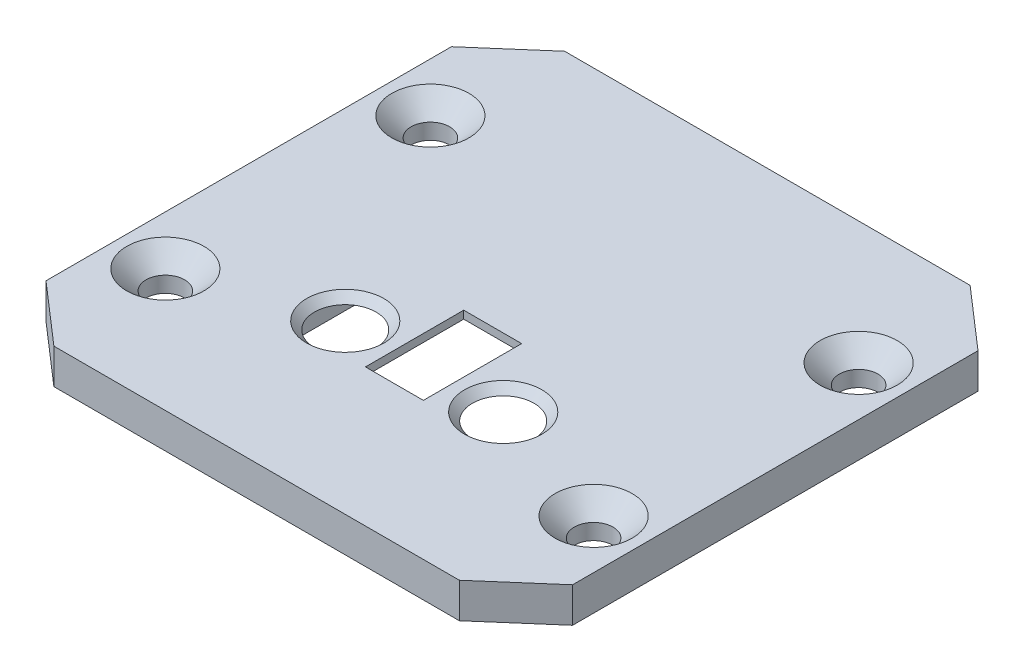
ISO-10303-21;
HEADER;
FILE_DESCRIPTION(('STEP AP214'),'2;1');
FILE_NAME('part.step','',(''),(''),'','','');
FILE_SCHEMA(('AUTOMOTIVE_DESIGN { 1 0 10303 214 1 1 1 1 }'));
ENDSEC;
DATA;
#1=APPLICATION_CONTEXT('core data for automotive mechanical design processes');
#2=APPLICATION_PROTOCOL_DEFINITION('international standard','automotive_design',2000,#1);
#3=PRODUCT_CONTEXT('',#1,'mechanical');
#4=PRODUCT('Part','Part','',(#3));
#5=PRODUCT_RELATED_PRODUCT_CATEGORY('part','',(#4));
#6=PRODUCT_DEFINITION_FORMATION('','',#4);
#7=PRODUCT_DEFINITION_CONTEXT('part definition',#1,'design');
#8=PRODUCT_DEFINITION('design','',#6,#7);
#9=PRODUCT_DEFINITION_SHAPE('','',#8);
#10=(LENGTH_UNIT() NAMED_UNIT(*) SI_UNIT(.MILLI.,.METRE.));
#11=(NAMED_UNIT(*) PLANE_ANGLE_UNIT() SI_UNIT($,.RADIAN.));
#12=(NAMED_UNIT(*) SI_UNIT($,.STERADIAN.) SOLID_ANGLE_UNIT());
#13=UNCERTAINTY_MEASURE_WITH_UNIT(LENGTH_MEASURE(1.E-05),#10,'distance_accuracy_value','');
#14=(GEOMETRIC_REPRESENTATION_CONTEXT(3) GLOBAL_UNCERTAINTY_ASSIGNED_CONTEXT((#13)) GLOBAL_UNIT_ASSIGNED_CONTEXT((#10,
#11,#12)) REPRESENTATION_CONTEXT('',''));
#15=CARTESIAN_POINT('',(0.,0.,0.));
#16=DIRECTION('',(0.,0.,1.));
#17=DIRECTION('',(1.,0.,0.));
#18=AXIS2_PLACEMENT_3D('',#15,#16,#17);
#19=CARTESIAN_POINT('',(0.,0.,0.));
#20=DIRECTION('',(0.,1.,0.));
#21=DIRECTION('',(0.,0.,1.));
#22=AXIS2_PLACEMENT_3D('',#19,#20,#21);
#23=PLANE('',#22);
#24=DIRECTION('',(-0.754605522163498,0.,0.656178714924794));
#25=VECTOR('',#24,1.);
#26=CARTESIAN_POINT('',(-6.6972861855531,0.,-22.7975658796558));
#27=LINE('',#26,#25);
#28=CARTESIAN_POINT('',(-6.6972861855531,0.,-22.7975658796558));
#29=VERTEX_POINT('',#28);
#30=CARTESIAN_POINT('',(-10.1472861855532,0.,-19.7975658796556));
#31=VERTEX_POINT('',#30);
#32=EDGE_CURVE('E275',#29,#31,#27,.T.);
#33=ORIENTED_EDGE('',*,*,#32,.F.);
#34=DIRECTION('',(-1.,0.,0.));
#35=VECTOR('',#34,1.);
#36=CARTESIAN_POINT('',(16.4027138144468,0.,-22.7975658796558));
#37=LINE('',#36,#35);
#38=CARTESIAN_POINT('',(16.4027138144468,0.,-22.7975658796558));
#39=VERTEX_POINT('',#38);
#40=EDGE_CURVE('E260',#39,#29,#37,.T.);
#41=ORIENTED_EDGE('',*,*,#40,.F.);
#42=DIRECTION('',(-0.754605522163498,0.,-0.656178714924794));
#43=VECTOR('',#42,1.);
#44=CARTESIAN_POINT('',(19.8527138144469,0.,-19.7975658796556));
#45=LINE('',#44,#43);
#46=CARTESIAN_POINT('',(19.8527138144469,0.,-19.7975658796556));
#47=VERTEX_POINT('',#46);
#48=EDGE_CURVE('E288',#47,#39,#45,.T.);
#49=ORIENTED_EDGE('',*,*,#48,.F.);
#50=DIRECTION('',(0.,0.,-1.));
#51=VECTOR('',#50,1.);
#52=CARTESIAN_POINT('',(19.8527138144469,0.,3.30243412034426));
#53=LINE('',#52,#51);
#54=CARTESIAN_POINT('',(19.8527138144469,0.,3.30243412034426));
#55=VERTEX_POINT('',#54);
#56=EDGE_CURVE('E286',#55,#47,#53,.T.);
#57=ORIENTED_EDGE('',*,*,#56,.F.);
#58=DIRECTION('',(0.754605522163498,0.,-0.656178714924794));
#59=VECTOR('',#58,1.);
#60=CARTESIAN_POINT('',(16.4027138144468,0.,6.30243412034437));
#61=LINE('',#60,#59);
#62=CARTESIAN_POINT('',(16.4027138144468,0.,6.30243412034437));
#63=VERTEX_POINT('',#62);
#64=EDGE_CURVE('E284',#63,#55,#61,.T.);
#65=ORIENTED_EDGE('',*,*,#64,.F.);
#66=DIRECTION('',(1.,0.,0.));
#67=VECTOR('',#66,1.);
#68=CARTESIAN_POINT('',(-6.6972861855531,0.,6.30243412034437));
#69=LINE('',#68,#67);
#70=CARTESIAN_POINT('',(-6.6972861855531,0.,6.30243412034437));
#71=VERTEX_POINT('',#70);
#72=EDGE_CURVE('E282',#71,#63,#69,.T.);
#73=ORIENTED_EDGE('',*,*,#72,.F.);
#74=DIRECTION('',(0.754605522163498,0.,0.656178714924794));
#75=VECTOR('',#74,1.);
#76=CARTESIAN_POINT('',(-10.1472861855532,0.,3.30243412034426));
#77=LINE('',#76,#75);
#78=CARTESIAN_POINT('',(-10.1472861855532,0.,3.30243412034426));
#79=VERTEX_POINT('',#78);
#80=EDGE_CURVE('E280',#79,#71,#77,.T.);
#81=ORIENTED_EDGE('',*,*,#80,.F.);
#82=DIRECTION('',(0.,0.,1.));
#83=VECTOR('',#82,1.);
#84=CARTESIAN_POINT('',(-10.1472861855532,0.,-19.7975658796556));
#85=LINE('',#84,#83);
#86=EDGE_CURVE('E278',#31,#79,#85,.T.);
#87=ORIENTED_EDGE('',*,*,#86,.F.);
#88=EDGE_LOOP('',(#33,#41,#49,#57,#65,#73,#81,#87));
#89=FACE_BOUND('',#88,.T.);
#90=CARTESIAN_POINT('',(-7.34728618555326,0.,-0.697565879655465));
#91=DIRECTION('',(0.,1.,0.));
#92=DIRECTION('',(0.,0.,1.));
#93=AXIS2_PLACEMENT_3D('',#90,#91,#92);
#94=CIRCLE('',#93,1.1);
#95=CARTESIAN_POINT('',(-7.34728618555326,0.,0.402434120344534));
#96=VERTEX_POINT('',#95);
#97=EDGE_CURVE('E255',#96,#96,#94,.T.);
#98=ORIENTED_EDGE('',*,*,#97,.T.);
#99=EDGE_LOOP('',(#98));
#100=FACE_BOUND('',#99,.T.);
#101=CARTESIAN_POINT('',(17.0527138144468,0.,-0.697565879655465));
#102=DIRECTION('',(0.,1.,0.));
#103=DIRECTION('',(0.,0.,1.));
#104=AXIS2_PLACEMENT_3D('',#101,#102,#103);
#105=CIRCLE('',#104,1.1);
#106=CARTESIAN_POINT('',(17.0527138144468,0.,0.402434120344535));
#107=VERTEX_POINT('',#106);
#108=EDGE_CURVE('E248',#107,#107,#105,.T.);
#109=ORIENTED_EDGE('',*,*,#108,.T.);
#110=EDGE_LOOP('',(#109));
#111=FACE_BOUND('',#110,.T.);
#112=CARTESIAN_POINT('',(17.0527138144468,0.,-15.7975658796555));
#113=DIRECTION('',(0.,1.,0.));
#114=DIRECTION('',(0.,0.,1.));
#115=AXIS2_PLACEMENT_3D('',#112,#113,#114);
#116=CIRCLE('',#115,1.1);
#117=CARTESIAN_POINT('',(17.0527138144468,0.,-14.6975658796555));
#118=VERTEX_POINT('',#117);
#119=EDGE_CURVE('E241',#118,#118,#116,.T.);
#120=ORIENTED_EDGE('',*,*,#119,.T.);
#121=EDGE_LOOP('',(#120));
#122=FACE_BOUND('',#121,.T.);
#123=CARTESIAN_POINT('',(-7.34728618555326,0.,-15.7975658796555));
#124=DIRECTION('',(0.,1.,0.));
#125=DIRECTION('',(0.,0.,1.));
#126=AXIS2_PLACEMENT_3D('',#123,#124,#125);
#127=CIRCLE('',#126,1.1);
#128=CARTESIAN_POINT('',(-7.34728618555326,0.,-14.6975658796555));
#129=VERTEX_POINT('',#128);
#130=EDGE_CURVE('E234',#129,#129,#127,.T.);
#131=ORIENTED_EDGE('',*,*,#130,.T.);
#132=EDGE_LOOP('',(#131));
#133=FACE_BOUND('',#132,.T.);
#134=DIRECTION('',(0.,0.,1.));
#135=VECTOR('',#134,1.);
#136=CARTESIAN_POINT('',(-2.14728618555315,0.,-15.7475658796557));
#137=LINE('',#136,#135);
#138=CARTESIAN_POINT('',(-2.14728618555315,0.,-15.7475658796557));
#139=VERTEX_POINT('',#138);
#140=CARTESIAN_POINT('',(-2.14728618555315,0.,-0.747565879655695));
#141=VERTEX_POINT('',#140);
#142=EDGE_CURVE('E197',#139,#141,#137,.T.);
#143=ORIENTED_EDGE('',*,*,#142,.T.);
#144=DIRECTION('',(1.,0.,0.));
#145=VECTOR('',#144,1.);
#146=CARTESIAN_POINT('',(11.8527138144469,0.,-0.747565879655697));
#147=LINE('',#146,#145);
#148=CARTESIAN_POINT('',(11.8527138144469,0.,-0.747565879655697));
#149=VERTEX_POINT('',#148);
#150=EDGE_CURVE('E211',#141,#149,#147,.T.);
#151=ORIENTED_EDGE('',*,*,#150,.T.);
#152=DIRECTION('',(0.,0.,-1.));
#153=VECTOR('',#152,1.);
#154=CARTESIAN_POINT('',(11.8527138144469,0.,-15.7475658796557));
#155=LINE('',#154,#153);
#156=CARTESIAN_POINT('',(11.8527138144469,0.,-15.7475658796557));
#157=VERTEX_POINT('',#156);
#158=EDGE_CURVE('E214',#149,#157,#155,.T.);
#159=ORIENTED_EDGE('',*,*,#158,.T.);
#160=DIRECTION('',(-1.,0.,0.));
#161=VECTOR('',#160,1.);
#162=CARTESIAN_POINT('',(11.8527138144469,0.,-15.7475658796557));
#163=LINE('',#162,#161);
#164=EDGE_CURVE('E202',#157,#139,#163,.T.);
#165=ORIENTED_EDGE('',*,*,#164,.T.);
#166=EDGE_LOOP('',(#143,#151,#159,#165));
#167=FACE_BOUND('',#166,.T.);
#168=ADVANCED_FACE('F47',(#89,#100,#111,#122,#133,#167),#23,.F.);
#169=CARTESIAN_POINT('',(-6.6972861855531,2.,-22.7975658796558));
#170=DIRECTION('',(0.656178714924794,0.,0.754605522163498));
#171=DIRECTION('',(0.754605522163498,0.,-0.656178714924794));
#172=AXIS2_PLACEMENT_3D('',#169,#170,#171);
#173=PLANE('',#172);
#174=ORIENTED_EDGE('',*,*,#32,.T.);
#175=DIRECTION('',(0.,-1.,0.));
#176=VECTOR('',#175,1.);
#177=CARTESIAN_POINT('',(-10.1472861855532,2.,-19.7975658796556));
#178=LINE('',#177,#176);
#179=CARTESIAN_POINT('',(-10.1472861855532,2.,-19.7975658796556));
#180=VERTEX_POINT('',#179);
#181=EDGE_CURVE('E311',#180,#31,#178,.T.);
#182=ORIENTED_EDGE('',*,*,#181,.F.);
#183=DIRECTION('',(-0.754605522163498,0.,0.656178714924794));
#184=VECTOR('',#183,1.);
#185=CARTESIAN_POINT('',(-6.6972861855531,2.,-22.7975658796558));
#186=LINE('',#185,#184);
#187=CARTESIAN_POINT('',(-6.6972861855531,2.,-22.7975658796558));
#188=VERTEX_POINT('',#187);
#189=EDGE_CURVE('E256',#188,#180,#186,.T.);
#190=ORIENTED_EDGE('',*,*,#189,.F.);
#191=DIRECTION('',(0.,-1.,0.));
#192=VECTOR('',#191,1.);
#193=CARTESIAN_POINT('',(-6.6972861855531,2.,-22.7975658796558));
#194=LINE('',#193,#192);
#195=EDGE_CURVE('E274',#188,#29,#194,.T.);
#196=ORIENTED_EDGE('',*,*,#195,.T.);
#197=EDGE_LOOP('',(#174,#182,#190,#196));
#198=FACE_BOUND('',#197,.T.);
#199=ADVANCED_FACE('F49',(#198),#173,.F.);
#200=CARTESIAN_POINT('',(-10.1472861855532,2.,-19.7975658796556));
#201=DIRECTION('',(1.,0.,0.));
#202=DIRECTION('',(0.,0.,-1.));
#203=AXIS2_PLACEMENT_3D('',#200,#201,#202);
#204=PLANE('',#203);
#205=ORIENTED_EDGE('',*,*,#86,.T.);
#206=DIRECTION('',(0.,-1.,0.));
#207=VECTOR('',#206,1.);
#208=CARTESIAN_POINT('',(-10.1472861855532,2.,3.30243412034426));
#209=LINE('',#208,#207);
#210=CARTESIAN_POINT('',(-10.1472861855532,2.,3.30243412034426));
#211=VERTEX_POINT('',#210);
#212=EDGE_CURVE('E308',#211,#79,#209,.T.);
#213=ORIENTED_EDGE('',*,*,#212,.F.);
#214=DIRECTION('',(0.,0.,1.));
#215=VECTOR('',#214,1.);
#216=CARTESIAN_POINT('',(-10.1472861855532,2.,-19.7975658796556));
#217=LINE('',#216,#215);
#218=EDGE_CURVE('E259',#180,#211,#217,.T.);
#219=ORIENTED_EDGE('',*,*,#218,.F.);
#220=ORIENTED_EDGE('',*,*,#181,.T.);
#221=EDGE_LOOP('',(#205,#213,#219,#220));
#222=FACE_BOUND('',#221,.T.);
#223=ADVANCED_FACE('F354',(#222),#204,.F.);
#224=CARTESIAN_POINT('',(-10.1472861855532,2.,3.30243412034426));
#225=DIRECTION('',(0.656178714924794,0.,-0.754605522163498));
#226=DIRECTION('',(-0.754605522163498,0.,-0.656178714924794));
#227=AXIS2_PLACEMENT_3D('',#224,#225,#226);
#228=PLANE('',#227);
#229=ORIENTED_EDGE('',*,*,#80,.T.);
#230=DIRECTION('',(0.,-1.,0.));
#231=VECTOR('',#230,1.);
#232=CARTESIAN_POINT('',(-6.6972861855531,2.,6.30243412034437));
#233=LINE('',#232,#231);
#234=CARTESIAN_POINT('',(-6.6972861855531,2.,6.30243412034437));
#235=VERTEX_POINT('',#234);
#236=EDGE_CURVE('E305',#235,#71,#233,.T.);
#237=ORIENTED_EDGE('',*,*,#236,.F.);
#238=DIRECTION('',(0.754605522163498,0.,0.656178714924794));
#239=VECTOR('',#238,1.);
#240=CARTESIAN_POINT('',(-10.1472861855532,2.,3.30243412034426));
#241=LINE('',#240,#239);
#242=EDGE_CURVE('E262',#211,#235,#241,.T.);
#243=ORIENTED_EDGE('',*,*,#242,.F.);
#244=ORIENTED_EDGE('',*,*,#212,.T.);
#245=EDGE_LOOP('',(#229,#237,#243,#244));
#246=FACE_BOUND('',#245,.T.);
#247=ADVANCED_FACE('F380',(#246),#228,.F.);
#248=CARTESIAN_POINT('',(-6.6972861855531,2.,6.30243412034437));
#249=DIRECTION('',(0.,0.,-1.));
#250=DIRECTION('',(-1.,0.,0.));
#251=AXIS2_PLACEMENT_3D('',#248,#249,#250);
#252=PLANE('',#251);
#253=ORIENTED_EDGE('',*,*,#72,.T.);
#254=DIRECTION('',(0.,-1.,0.));
#255=VECTOR('',#254,1.);
#256=CARTESIAN_POINT('',(16.4027138144468,2.,6.30243412034437));
#257=LINE('',#256,#255);
#258=CARTESIAN_POINT('',(16.4027138144468,2.,6.30243412034437));
#259=VERTEX_POINT('',#258);
#260=EDGE_CURVE('E302',#259,#63,#257,.T.);
#261=ORIENTED_EDGE('',*,*,#260,.F.);
#262=DIRECTION('',(1.,0.,0.));
#263=VECTOR('',#262,1.);
#264=CARTESIAN_POINT('',(-6.6972861855531,2.,6.30243412034437));
#265=LINE('',#264,#263);
#266=EDGE_CURVE('E264',#235,#259,#265,.T.);
#267=ORIENTED_EDGE('',*,*,#266,.F.);
#268=ORIENTED_EDGE('',*,*,#236,.T.);
#269=EDGE_LOOP('',(#253,#261,#267,#268));
#270=FACE_BOUND('',#269,.T.);
#271=ADVANCED_FACE('F376',(#270),#252,.F.);
#272=CARTESIAN_POINT('',(16.4027138144468,2.,6.30243412034437));
#273=DIRECTION('',(-0.656178714924794,0.,-0.754605522163498));
#274=DIRECTION('',(-0.754605522163498,0.,0.656178714924794));
#275=AXIS2_PLACEMENT_3D('',#272,#273,#274);
#276=PLANE('',#275);
#277=ORIENTED_EDGE('',*,*,#64,.T.);
#278=DIRECTION('',(0.,-1.,0.));
#279=VECTOR('',#278,1.);
#280=CARTESIAN_POINT('',(19.8527138144469,2.,3.30243412034426));
#281=LINE('',#280,#279);
#282=CARTESIAN_POINT('',(19.8527138144469,2.,3.30243412034426));
#283=VERTEX_POINT('',#282);
#284=EDGE_CURVE('E299',#283,#55,#281,.T.);
#285=ORIENTED_EDGE('',*,*,#284,.F.);
#286=DIRECTION('',(0.754605522163498,0.,-0.656178714924794));
#287=VECTOR('',#286,1.);
#288=CARTESIAN_POINT('',(16.4027138144468,2.,6.30243412034437));
#289=LINE('',#288,#287);
#290=EDGE_CURVE('E266',#259,#283,#289,.T.);
#291=ORIENTED_EDGE('',*,*,#290,.F.);
#292=ORIENTED_EDGE('',*,*,#260,.T.);
#293=EDGE_LOOP('',(#277,#285,#291,#292));
#294=FACE_BOUND('',#293,.T.);
#295=ADVANCED_FACE('F372',(#294),#276,.F.);
#296=CARTESIAN_POINT('',(19.8527138144469,2.,3.30243412034426));
#297=DIRECTION('',(-1.,0.,0.));
#298=DIRECTION('',(0.,0.,1.));
#299=AXIS2_PLACEMENT_3D('',#296,#297,#298);
#300=PLANE('',#299);
#301=ORIENTED_EDGE('',*,*,#56,.T.);
#302=DIRECTION('',(0.,-1.,0.));
#303=VECTOR('',#302,1.);
#304=CARTESIAN_POINT('',(19.8527138144469,2.,-19.7975658796556));
#305=LINE('',#304,#303);
#306=CARTESIAN_POINT('',(19.8527138144469,2.,-19.7975658796556));
#307=VERTEX_POINT('',#306);
#308=EDGE_CURVE('E296',#307,#47,#305,.T.);
#309=ORIENTED_EDGE('',*,*,#308,.F.);
#310=DIRECTION('',(0.,0.,-1.));
#311=VECTOR('',#310,1.);
#312=CARTESIAN_POINT('',(19.8527138144469,2.,3.30243412034426));
#313=LINE('',#312,#311);
#314=EDGE_CURVE('E268',#283,#307,#313,.T.);
#315=ORIENTED_EDGE('',*,*,#314,.F.);
#316=ORIENTED_EDGE('',*,*,#284,.T.);
#317=EDGE_LOOP('',(#301,#309,#315,#316));
#318=FACE_BOUND('',#317,.T.);
#319=ADVANCED_FACE('F368',(#318),#300,.F.);
#320=CARTESIAN_POINT('',(19.8527138144469,2.,-19.7975658796556));
#321=DIRECTION('',(-0.656178714924794,0.,0.754605522163498));
#322=DIRECTION('',(0.754605522163498,0.,0.656178714924794));
#323=AXIS2_PLACEMENT_3D('',#320,#321,#322);
#324=PLANE('',#323);
#325=ORIENTED_EDGE('',*,*,#48,.T.);
#326=DIRECTION('',(0.,-1.,0.));
#327=VECTOR('',#326,1.);
#328=CARTESIAN_POINT('',(16.4027138144468,2.,-22.7975658796558));
#329=LINE('',#328,#327);
#330=CARTESIAN_POINT('',(16.4027138144468,2.,-22.7975658796558));
#331=VERTEX_POINT('',#330);
#332=EDGE_CURVE('E293',#331,#39,#329,.T.);
#333=ORIENTED_EDGE('',*,*,#332,.F.);
#334=DIRECTION('',(-0.754605522163498,0.,-0.656178714924794));
#335=VECTOR('',#334,1.);
#336=CARTESIAN_POINT('',(19.8527138144469,2.,-19.7975658796556));
#337=LINE('',#336,#335);
#338=EDGE_CURVE('E270',#307,#331,#337,.T.);
#339=ORIENTED_EDGE('',*,*,#338,.F.);
#340=ORIENTED_EDGE('',*,*,#308,.T.);
#341=EDGE_LOOP('',(#325,#333,#339,#340));
#342=FACE_BOUND('',#341,.T.);
#343=ADVANCED_FACE('F364',(#342),#324,.F.);
#344=CARTESIAN_POINT('',(16.4027138144468,2.,-22.7975658796558));
#345=DIRECTION('',(0.,0.,1.));
#346=DIRECTION('',(1.,0.,0.));
#347=AXIS2_PLACEMENT_3D('',#344,#345,#346);
#348=PLANE('',#347);
#349=ORIENTED_EDGE('',*,*,#40,.T.);
#350=ORIENTED_EDGE('',*,*,#195,.F.);
#351=DIRECTION('',(-1.,0.,0.));
#352=VECTOR('',#351,1.);
#353=CARTESIAN_POINT('',(16.4027138144468,2.,-22.7975658796558));
#354=LINE('',#353,#352);
#355=EDGE_CURVE('E272',#331,#188,#354,.T.);
#356=ORIENTED_EDGE('',*,*,#355,.F.);
#357=ORIENTED_EDGE('',*,*,#332,.T.);
#358=EDGE_LOOP('',(#349,#350,#356,#357));
#359=FACE_BOUND('',#358,.T.);
#360=ADVANCED_FACE('F361',(#359),#348,.F.);
#361=CARTESIAN_POINT('',(0.,2.,0.));
#362=DIRECTION('',(0.,1.,0.));
#363=DIRECTION('',(0.,0.,1.));
#364=AXIS2_PLACEMENT_3D('',#361,#362,#363);
#365=PLANE('',#364);
#366=DIRECTION('',(0.,0.,1.));
#367=VECTOR('',#366,1.);
#368=CARTESIAN_POINT('',(3.20271381444685,2.,-1.54756587965569));
#369=LINE('',#368,#367);
#370=CARTESIAN_POINT('',(3.20271381444685,2.,-7.14756587965569));
#371=VERTEX_POINT('',#370);
#372=CARTESIAN_POINT('',(3.20271381444685,2.,-1.54756587965569));
#373=VERTEX_POINT('',#372);
#374=EDGE_CURVE('E62',#371,#373,#369,.T.);
#375=ORIENTED_EDGE('',*,*,#374,.F.);
#376=DIRECTION('',(-1.,0.,0.));
#377=VECTOR('',#376,1.);
#378=CARTESIAN_POINT('',(3.20271381444685,2.,-7.14756587965569));
#379=LINE('',#378,#377);
#380=CARTESIAN_POINT('',(6.50271381444685,2.,-7.14756587965569));
#381=VERTEX_POINT('',#380);
#382=EDGE_CURVE('E178',#381,#371,#379,.T.);
#383=ORIENTED_EDGE('',*,*,#382,.F.);
#384=DIRECTION('',(0.,0.,-1.));
#385=VECTOR('',#384,1.);
#386=CARTESIAN_POINT('',(6.50271381444685,2.,-1.54756587965569));
#387=LINE('',#386,#385);
#388=CARTESIAN_POINT('',(6.50271381444685,2.,-1.54756587965569));
#389=VERTEX_POINT('',#388);
#390=EDGE_CURVE('E162',#389,#381,#387,.T.);
#391=ORIENTED_EDGE('',*,*,#390,.F.);
#392=DIRECTION('',(1.,0.,0.));
#393=VECTOR('',#392,1.);
#394=CARTESIAN_POINT('',(3.20271381444685,2.,-1.54756587965569));
#395=LINE('',#394,#393);
#396=EDGE_CURVE('E171',#373,#389,#395,.T.);
#397=ORIENTED_EDGE('',*,*,#396,.F.);
#398=EDGE_LOOP('',(#375,#383,#391,#397));
#399=FACE_BOUND('',#398,.T.);
#400=CARTESIAN_POINT('',(9.35271381444686,2.,-3.2475658796557));
#401=DIRECTION('',(0.,1.,0.));
#402=DIRECTION('',(0.,0.,1.));
#403=AXIS2_PLACEMENT_3D('',#400,#401,#402);
#404=CIRCLE('',#403,2.2);
#405=CARTESIAN_POINT('',(9.35271381444686,2.,-1.04756587965569));
#406=VERTEX_POINT('',#405);
#407=EDGE_CURVE('E185',#406,#406,#404,.T.);
#408=ORIENTED_EDGE('',*,*,#407,.F.);
#409=EDGE_LOOP('',(#408));
#410=FACE_BOUND('',#409,.T.);
#411=CARTESIAN_POINT('',(0.352713814446856,2.,-3.2475658796557));
#412=DIRECTION('',(0.,1.,0.));
#413=DIRECTION('',(0.,0.,1.));
#414=AXIS2_PLACEMENT_3D('',#411,#412,#413);
#415=CIRCLE('',#414,2.2);
#416=CARTESIAN_POINT('',(0.352713814446856,2.,-1.0475658796557));
#417=VERTEX_POINT('',#416);
#418=EDGE_CURVE('E191',#417,#417,#415,.T.);
#419=ORIENTED_EDGE('',*,*,#418,.F.);
#420=EDGE_LOOP('',(#419));
#421=FACE_BOUND('',#420,.T.);
#422=CARTESIAN_POINT('',(-7.34728618555326,2.,-15.7975658796555));
#423=DIRECTION('',(0.,1.,0.));
#424=DIRECTION('',(0.,0.,1.));
#425=AXIS2_PLACEMENT_3D('',#422,#423,#424);
#426=CIRCLE('',#425,2.2);
#427=CARTESIAN_POINT('',(-7.34728618555326,2.,-13.5975658796555));
#428=VERTEX_POINT('',#427);
#429=EDGE_CURVE('E228',#428,#428,#426,.T.);
#430=ORIENTED_EDGE('',*,*,#429,.F.);
#431=EDGE_LOOP('',(#430));
#432=FACE_BOUND('',#431,.T.);
#433=CARTESIAN_POINT('',(17.0527138144468,2.,-15.7975658796555));
#434=DIRECTION('',(0.,1.,0.));
#435=DIRECTION('',(0.,0.,1.));
#436=AXIS2_PLACEMENT_3D('',#433,#434,#435);
#437=CIRCLE('',#436,2.2);
#438=CARTESIAN_POINT('',(17.0527138144468,2.,-13.5975658796555));
#439=VERTEX_POINT('',#438);
#440=EDGE_CURVE('E235',#439,#439,#437,.T.);
#441=ORIENTED_EDGE('',*,*,#440,.F.);
#442=EDGE_LOOP('',(#441));
#443=FACE_BOUND('',#442,.T.);
#444=CARTESIAN_POINT('',(17.0527138144468,2.,-0.697565879655465));
#445=DIRECTION('',(0.,1.,0.));
#446=DIRECTION('',(0.,0.,1.));
#447=AXIS2_PLACEMENT_3D('',#444,#445,#446);
#448=CIRCLE('',#447,2.2);
#449=CARTESIAN_POINT('',(17.0527138144468,2.,1.50243412034454));
#450=VERTEX_POINT('',#449);
#451=EDGE_CURVE('E242',#450,#450,#448,.T.);
#452=ORIENTED_EDGE('',*,*,#451,.F.);
#453=EDGE_LOOP('',(#452));
#454=FACE_BOUND('',#453,.T.);
#455=CARTESIAN_POINT('',(-7.34728618555326,2.,-0.697565879655465));
#456=DIRECTION('',(0.,1.,0.));
#457=DIRECTION('',(0.,0.,1.));
#458=AXIS2_PLACEMENT_3D('',#455,#456,#457);
#459=CIRCLE('',#458,2.2);
#460=CARTESIAN_POINT('',(-7.34728618555326,2.,1.50243412034454));
#461=VERTEX_POINT('',#460);
#462=EDGE_CURVE('E249',#461,#461,#459,.T.);
#463=ORIENTED_EDGE('',*,*,#462,.F.);
#464=EDGE_LOOP('',(#463));
#465=FACE_BOUND('',#464,.T.);
#466=ORIENTED_EDGE('',*,*,#189,.T.);
#467=ORIENTED_EDGE('',*,*,#218,.T.);
#468=ORIENTED_EDGE('',*,*,#242,.T.);
#469=ORIENTED_EDGE('',*,*,#266,.T.);
#470=ORIENTED_EDGE('',*,*,#290,.T.);
#471=ORIENTED_EDGE('',*,*,#314,.T.);
#472=ORIENTED_EDGE('',*,*,#338,.T.);
#473=ORIENTED_EDGE('',*,*,#355,.T.);
#474=EDGE_LOOP('',(#466,#467,#468,#469,#470,#471,#472,#473));
#475=FACE_BOUND('',#474,.T.);
#476=ADVANCED_FACE('F175',(#399,#410,#421,#432,#443,#454,#465,#475),#365,.T.);
#477=CARTESIAN_POINT('',(-7.34728618555326,2.,-0.697565879655465));
#478=DIRECTION('',(0.,1.,0.));
#479=DIRECTION('',(0.,0.,1.));
#480=AXIS2_PLACEMENT_3D('',#477,#478,#479);
#481=CYLINDRICAL_SURFACE('',#480,1.1);
#482=CARTESIAN_POINT('',(-7.34728618555326,0.9,-0.697565879655465));
#483=DIRECTION('',(0.,1.,0.));
#484=DIRECTION('',(0.,0.,1.));
#485=AXIS2_PLACEMENT_3D('',#482,#483,#484);
#486=CIRCLE('',#485,1.1);
#487=CARTESIAN_POINT('',(-7.34728618555326,0.9,0.402434120344534));
#488=VERTEX_POINT('',#487);
#489=EDGE_CURVE('E252',#488,#488,#486,.T.);
#490=ORIENTED_EDGE('',*,*,#489,.T.);
#491=EDGE_LOOP('',(#490));
#492=FACE_BOUND('',#491,.T.);
#493=ORIENTED_EDGE('',*,*,#97,.F.);
#494=EDGE_LOOP('',(#493));
#495=FACE_BOUND('',#494,.T.);
#496=ADVANCED_FACE('F411',(#492,#495),#481,.F.);
#497=CARTESIAN_POINT('',(-7.34728618555326,2.,-0.697565879655465));
#498=DIRECTION('',(0.,1.,0.));
#499=DIRECTION('',(0.,0.,1.));
#500=AXIS2_PLACEMENT_3D('',#497,#498,#499);
#501=CONICAL_SURFACE('',#500,2.2,0.785398163397448);
#502=ORIENTED_EDGE('',*,*,#489,.F.);
#503=EDGE_LOOP('',(#502));
#504=FACE_BOUND('',#503,.T.);
#505=ORIENTED_EDGE('',*,*,#462,.T.);
#506=EDGE_LOOP('',(#505));
#507=FACE_BOUND('',#506,.T.);
#508=ADVANCED_FACE('F415',(#504,#507),#501,.F.);
#509=CARTESIAN_POINT('',(17.0527138144468,2.,-0.697565879655465));
#510=DIRECTION('',(0.,1.,0.));
#511=DIRECTION('',(0.,0.,1.));
#512=AXIS2_PLACEMENT_3D('',#509,#510,#511);
#513=CYLINDRICAL_SURFACE('',#512,1.1);
#514=CARTESIAN_POINT('',(17.0527138144468,0.9,-0.697565879655465));
#515=DIRECTION('',(0.,1.,0.));
#516=DIRECTION('',(0.,0.,1.));
#517=AXIS2_PLACEMENT_3D('',#514,#515,#516);
#518=CIRCLE('',#517,1.1);
#519=CARTESIAN_POINT('',(17.0527138144468,0.9,0.402434120344535));
#520=VERTEX_POINT('',#519);
#521=EDGE_CURVE('E245',#520,#520,#518,.T.);
#522=ORIENTED_EDGE('',*,*,#521,.T.);
#523=EDGE_LOOP('',(#522));
#524=FACE_BOUND('',#523,.T.);
#525=ORIENTED_EDGE('',*,*,#108,.F.);
#526=EDGE_LOOP('',(#525));
#527=FACE_BOUND('',#526,.T.);
#528=ADVANCED_FACE('F420',(#524,#527),#513,.F.);
#529=CARTESIAN_POINT('',(17.0527138144468,2.,-0.697565879655465));
#530=DIRECTION('',(0.,1.,0.));
#531=DIRECTION('',(0.,0.,1.));
#532=AXIS2_PLACEMENT_3D('',#529,#530,#531);
#533=CONICAL_SURFACE('',#532,2.2,0.785398163397448);
#534=ORIENTED_EDGE('',*,*,#521,.F.);
#535=EDGE_LOOP('',(#534));
#536=FACE_BOUND('',#535,.T.);
#537=ORIENTED_EDGE('',*,*,#451,.T.);
#538=EDGE_LOOP('',(#537));
#539=FACE_BOUND('',#538,.T.);
#540=ADVANCED_FACE('F427',(#536,#539),#533,.F.);
#541=CARTESIAN_POINT('',(17.0527138144468,2.,-15.7975658796555));
#542=DIRECTION('',(0.,1.,0.));
#543=DIRECTION('',(0.,0.,1.));
#544=AXIS2_PLACEMENT_3D('',#541,#542,#543);
#545=CYLINDRICAL_SURFACE('',#544,1.1);
#546=CARTESIAN_POINT('',(17.0527138144468,0.9,-15.7975658796555));
#547=DIRECTION('',(0.,1.,0.));
#548=DIRECTION('',(0.,0.,1.));
#549=AXIS2_PLACEMENT_3D('',#546,#547,#548);
#550=CIRCLE('',#549,1.1);
#551=CARTESIAN_POINT('',(17.0527138144468,0.9,-14.6975658796555));
#552=VERTEX_POINT('',#551);
#553=EDGE_CURVE('E238',#552,#552,#550,.T.);
#554=ORIENTED_EDGE('',*,*,#553,.T.);
#555=EDGE_LOOP('',(#554));
#556=FACE_BOUND('',#555,.T.);
#557=ORIENTED_EDGE('',*,*,#119,.F.);
#558=EDGE_LOOP('',(#557));
#559=FACE_BOUND('',#558,.T.);
#560=ADVANCED_FACE('F431',(#556,#559),#545,.F.);
#561=CARTESIAN_POINT('',(17.0527138144468,2.,-15.7975658796555));
#562=DIRECTION('',(0.,1.,0.));
#563=DIRECTION('',(0.,0.,1.));
#564=AXIS2_PLACEMENT_3D('',#561,#562,#563);
#565=CONICAL_SURFACE('',#564,2.2,0.785398163397448);
#566=ORIENTED_EDGE('',*,*,#553,.F.);
#567=EDGE_LOOP('',(#566));
#568=FACE_BOUND('',#567,.T.);
#569=ORIENTED_EDGE('',*,*,#440,.T.);
#570=EDGE_LOOP('',(#569));
#571=FACE_BOUND('',#570,.T.);
#572=ADVANCED_FACE('F435',(#568,#571),#565,.F.);
#573=CARTESIAN_POINT('',(-7.34728618555326,2.,-15.7975658796555));
#574=DIRECTION('',(0.,1.,0.));
#575=DIRECTION('',(0.,0.,1.));
#576=AXIS2_PLACEMENT_3D('',#573,#574,#575);
#577=CYLINDRICAL_SURFACE('',#576,1.1);
#578=CARTESIAN_POINT('',(-7.34728618555326,0.9,-15.7975658796555));
#579=DIRECTION('',(0.,1.,0.));
#580=DIRECTION('',(0.,0.,1.));
#581=AXIS2_PLACEMENT_3D('',#578,#579,#580);
#582=CIRCLE('',#581,1.1);
#583=CARTESIAN_POINT('',(-7.34728618555326,0.9,-14.6975658796555));
#584=VERTEX_POINT('',#583);
#585=EDGE_CURVE('E231',#584,#584,#582,.T.);
#586=ORIENTED_EDGE('',*,*,#585,.T.);
#587=EDGE_LOOP('',(#586));
#588=FACE_BOUND('',#587,.T.);
#589=ORIENTED_EDGE('',*,*,#130,.F.);
#590=EDGE_LOOP('',(#589));
#591=FACE_BOUND('',#590,.T.);
#592=ADVANCED_FACE('F439',(#588,#591),#577,.F.);
#593=CARTESIAN_POINT('',(-7.34728618555326,2.,-15.7975658796555));
#594=DIRECTION('',(0.,1.,0.));
#595=DIRECTION('',(0.,0.,1.));
#596=AXIS2_PLACEMENT_3D('',#593,#594,#595);
#597=CONICAL_SURFACE('',#596,2.2,0.785398163397448);
#598=ORIENTED_EDGE('',*,*,#585,.F.);
#599=EDGE_LOOP('',(#598));
#600=FACE_BOUND('',#599,.T.);
#601=ORIENTED_EDGE('',*,*,#429,.T.);
#602=EDGE_LOOP('',(#601));
#603=FACE_BOUND('',#602,.T.);
#604=ADVANCED_FACE('F443',(#600,#603),#597,.F.);
#605=CARTESIAN_POINT('',(-2.14728618555315,1.555,-15.7475658796557));
#606=DIRECTION('',(1.,0.,0.));
#607=DIRECTION('',(0.,0.,-1.));
#608=AXIS2_PLACEMENT_3D('',#605,#606,#607);
#609=PLANE('',#608);
#610=ORIENTED_EDGE('',*,*,#142,.F.);
#611=DIRECTION('',(0.,-1.,0.));
#612=VECTOR('',#611,1.);
#613=CARTESIAN_POINT('',(-2.14728618555315,1.555,-15.7475658796557));
#614=LINE('',#613,#612);
#615=CARTESIAN_POINT('',(-2.14728618555315,1.555,-15.7475658796557));
#616=VERTEX_POINT('',#615);
#617=EDGE_CURVE('E208',#616,#139,#614,.T.);
#618=ORIENTED_EDGE('',*,*,#617,.F.);
#619=DIRECTION('',(0.,0.,1.));
#620=VECTOR('',#619,1.);
#621=CARTESIAN_POINT('',(-2.14728618555315,1.555,-15.7475658796557));
#622=LINE('',#621,#620);
#623=CARTESIAN_POINT('',(-2.14728618555315,1.555,-0.747565879655695));
#624=VERTEX_POINT('',#623);
#625=EDGE_CURVE('E198',#616,#624,#622,.T.);
#626=ORIENTED_EDGE('',*,*,#625,.T.);
#627=DIRECTION('',(0.,-1.,0.));
#628=VECTOR('',#627,1.);
#629=CARTESIAN_POINT('',(-2.14728618555315,1.555,-0.747565879655695));
#630=LINE('',#629,#628);
#631=EDGE_CURVE('E225',#624,#141,#630,.T.);
#632=ORIENTED_EDGE('',*,*,#631,.T.);
#633=EDGE_LOOP('',(#610,#618,#626,#632));
#634=FACE_BOUND('',#633,.T.);
#635=ADVANCED_FACE('F447',(#634),#609,.T.);
#636=CARTESIAN_POINT('',(11.8527138144469,1.555,-0.747565879655697));
#637=DIRECTION('',(0.,0.,-1.));
#638=DIRECTION('',(-1.,0.,0.));
#639=AXIS2_PLACEMENT_3D('',#636,#637,#638);
#640=PLANE('',#639);
#641=ORIENTED_EDGE('',*,*,#150,.F.);
#642=ORIENTED_EDGE('',*,*,#631,.F.);
#643=DIRECTION('',(1.,0.,0.));
#644=VECTOR('',#643,1.);
#645=CARTESIAN_POINT('',(11.8527138144469,1.555,-0.747565879655697));
#646=LINE('',#645,#644);
#647=CARTESIAN_POINT('',(11.8527138144469,1.555,-0.747565879655697));
#648=VERTEX_POINT('',#647);
#649=EDGE_CURVE('E201',#624,#648,#646,.T.);
#650=ORIENTED_EDGE('',*,*,#649,.T.);
#651=DIRECTION('',(0.,-1.,0.));
#652=VECTOR('',#651,1.);
#653=CARTESIAN_POINT('',(11.8527138144469,1.555,-0.747565879655697));
#654=LINE('',#653,#652);
#655=EDGE_CURVE('E223',#648,#149,#654,.T.);
#656=ORIENTED_EDGE('',*,*,#655,.T.);
#657=EDGE_LOOP('',(#641,#642,#650,#656));
#658=FACE_BOUND('',#657,.T.);
#659=ADVANCED_FACE('F451',(#658),#640,.T.);
#660=CARTESIAN_POINT('',(11.8527138144469,1.555,-15.7475658796557));
#661=DIRECTION('',(-1.,0.,0.));
#662=DIRECTION('',(0.,0.,1.));
#663=AXIS2_PLACEMENT_3D('',#660,#661,#662);
#664=PLANE('',#663);
#665=ORIENTED_EDGE('',*,*,#158,.F.);
#666=ORIENTED_EDGE('',*,*,#655,.F.);
#667=DIRECTION('',(0.,0.,-1.));
#668=VECTOR('',#667,1.);
#669=CARTESIAN_POINT('',(11.8527138144469,1.555,-15.7475658796557));
#670=LINE('',#669,#668);
#671=CARTESIAN_POINT('',(11.8527138144469,1.555,-15.7475658796557));
#672=VERTEX_POINT('',#671);
#673=EDGE_CURVE('E204',#648,#672,#670,.T.);
#674=ORIENTED_EDGE('',*,*,#673,.T.);
#675=DIRECTION('',(0.,-1.,0.));
#676=VECTOR('',#675,1.);
#677=CARTESIAN_POINT('',(11.8527138144469,1.555,-15.7475658796557));
#678=LINE('',#677,#676);
#679=EDGE_CURVE('E221',#672,#157,#678,.T.);
#680=ORIENTED_EDGE('',*,*,#679,.T.);
#681=EDGE_LOOP('',(#665,#666,#674,#680));
#682=FACE_BOUND('',#681,.T.);
#683=ADVANCED_FACE('F455',(#682),#664,.T.);
#684=CARTESIAN_POINT('',(11.8527138144469,1.555,-15.7475658796557));
#685=DIRECTION('',(0.,0.,1.));
#686=DIRECTION('',(1.,0.,0.));
#687=AXIS2_PLACEMENT_3D('',#684,#685,#686);
#688=PLANE('',#687);
#689=ORIENTED_EDGE('',*,*,#164,.F.);
#690=ORIENTED_EDGE('',*,*,#679,.F.);
#691=DIRECTION('',(-1.,0.,0.));
#692=VECTOR('',#691,1.);
#693=CARTESIAN_POINT('',(11.8527138144469,1.555,-15.7475658796557));
#694=LINE('',#693,#692);
#695=EDGE_CURVE('E206',#672,#616,#694,.T.);
#696=ORIENTED_EDGE('',*,*,#695,.T.);
#697=ORIENTED_EDGE('',*,*,#617,.T.);
#698=EDGE_LOOP('',(#689,#690,#696,#697));
#699=FACE_BOUND('',#698,.T.);
#700=ADVANCED_FACE('F459',(#699),#688,.T.);
#701=CARTESIAN_POINT('',(0.,1.555,0.));
#702=DIRECTION('',(0.,-1.,0.));
#703=DIRECTION('',(0.,0.,-1.));
#704=AXIS2_PLACEMENT_3D('',#701,#702,#703);
#705=PLANE('',#704);
#706=DIRECTION('',(0.,0.,-1.));
#707=VECTOR('',#706,1.);
#708=CARTESIAN_POINT('',(3.20271381444685,1.555,0.));
#709=LINE('',#708,#707);
#710=CARTESIAN_POINT('',(3.20271381444685,1.555,-1.54756587965569));
#711=VERTEX_POINT('',#710);
#712=CARTESIAN_POINT('',(3.20271381444685,1.555,-7.14756587965569));
#713=VERTEX_POINT('',#712);
#714=EDGE_CURVE('E11',#711,#713,#709,.T.);
#715=ORIENTED_EDGE('',*,*,#714,.F.);
#716=DIRECTION('',(-1.,0.,0.));
#717=VECTOR('',#716,1.);
#718=CARTESIAN_POINT('',(0.,1.555,-1.54756587965569));
#719=LINE('',#718,#717);
#720=CARTESIAN_POINT('',(6.50271381444685,1.555,-1.54756587965569));
#721=VERTEX_POINT('',#720);
#722=EDGE_CURVE('E314',#721,#711,#719,.T.);
#723=ORIENTED_EDGE('',*,*,#722,.F.);
#724=DIRECTION('',(0.,0.,1.));
#725=VECTOR('',#724,1.);
#726=CARTESIAN_POINT('',(6.50271381444685,1.555,0.));
#727=LINE('',#726,#725);
#728=CARTESIAN_POINT('',(6.50271381444685,1.555,-7.14756587965569));
#729=VERTEX_POINT('',#728);
#730=EDGE_CURVE('E165',#729,#721,#727,.T.);
#731=ORIENTED_EDGE('',*,*,#730,.F.);
#732=DIRECTION('',(1.,0.,0.));
#733=VECTOR('',#732,1.);
#734=CARTESIAN_POINT('',(0.,1.555,-7.14756587965569));
#735=LINE('',#734,#733);
#736=EDGE_CURVE('E55',#713,#729,#735,.T.);
#737=ORIENTED_EDGE('',*,*,#736,.F.);
#738=EDGE_LOOP('',(#715,#723,#731,#737));
#739=FACE_BOUND('',#738,.T.);
#740=CARTESIAN_POINT('',(9.35271381444686,1.555,-3.2475658796557));
#741=DIRECTION('',(0.,-1.,0.));
#742=DIRECTION('',(0.,0.,-1.));
#743=AXIS2_PLACEMENT_3D('',#740,#741,#742);
#744=CIRCLE('',#743,1.755);
#745=CARTESIAN_POINT('',(9.35271381444686,1.555,-5.0025658796557));
#746=VERTEX_POINT('',#745);
#747=EDGE_CURVE('E190',#746,#746,#744,.T.);
#748=ORIENTED_EDGE('',*,*,#747,.F.);
#749=EDGE_LOOP('',(#748));
#750=FACE_BOUND('',#749,.T.);
#751=CARTESIAN_POINT('',(0.352713814446856,1.555,-3.2475658796557));
#752=DIRECTION('',(0.,-1.,0.));
#753=DIRECTION('',(0.,0.,-1.));
#754=AXIS2_PLACEMENT_3D('',#751,#752,#753);
#755=CIRCLE('',#754,1.755);
#756=CARTESIAN_POINT('',(0.352713814446856,1.555,-5.0025658796557));
#757=VERTEX_POINT('',#756);
#758=EDGE_CURVE('E194',#757,#757,#755,.T.);
#759=ORIENTED_EDGE('',*,*,#758,.F.);
#760=EDGE_LOOP('',(#759));
#761=FACE_BOUND('',#760,.T.);
#762=ORIENTED_EDGE('',*,*,#625,.F.);
#763=ORIENTED_EDGE('',*,*,#695,.F.);
#764=ORIENTED_EDGE('',*,*,#673,.F.);
#765=ORIENTED_EDGE('',*,*,#649,.F.);
#766=EDGE_LOOP('',(#762,#763,#764,#765));
#767=FACE_BOUND('',#766,.T.);
#768=ADVANCED_FACE('F332',(#739,#750,#761,#767),#705,.T.);
#769=CARTESIAN_POINT('',(0.352713814446856,2.,-3.2475658796557));
#770=DIRECTION('',(0.,1.,0.));
#771=DIRECTION('',(0.,0.,1.));
#772=AXIS2_PLACEMENT_3D('',#769,#770,#771);
#773=CONICAL_SURFACE('',#772,2.2,0.785398163397448);
#774=ORIENTED_EDGE('',*,*,#758,.T.);
#775=EDGE_LOOP('',(#774));
#776=FACE_BOUND('',#775,.T.);
#777=ORIENTED_EDGE('',*,*,#418,.T.);
#778=EDGE_LOOP('',(#777));
#779=FACE_BOUND('',#778,.T.);
#780=ADVANCED_FACE('F344',(#776,#779),#773,.F.);
#781=CARTESIAN_POINT('',(9.35271381444686,2.,-3.2475658796557));
#782=DIRECTION('',(0.,1.,0.));
#783=DIRECTION('',(0.,0.,1.));
#784=AXIS2_PLACEMENT_3D('',#781,#782,#783);
#785=CONICAL_SURFACE('',#784,2.2,0.785398163397449);
#786=ORIENTED_EDGE('',*,*,#747,.T.);
#787=EDGE_LOOP('',(#786));
#788=FACE_BOUND('',#787,.T.);
#789=ORIENTED_EDGE('',*,*,#407,.T.);
#790=EDGE_LOOP('',(#789));
#791=FACE_BOUND('',#790,.T.);
#792=ADVANCED_FACE('F336',(#788,#791),#785,.F.);
#793=CARTESIAN_POINT('',(3.20271381444685,0.,-1.54756587965569));
#794=DIRECTION('',(-1.,0.,0.));
#795=DIRECTION('',(0.,0.,1.));
#796=AXIS2_PLACEMENT_3D('',#793,#794,#795);
#797=PLANE('',#796);
#798=ORIENTED_EDGE('',*,*,#714,.T.);
#799=DIRECTION('',(0.,1.,0.));
#800=VECTOR('',#799,1.);
#801=CARTESIAN_POINT('',(3.20271381444685,0.,-7.14756587965569));
#802=LINE('',#801,#800);
#803=EDGE_CURVE('E183',#713,#371,#802,.T.);
#804=ORIENTED_EDGE('',*,*,#803,.T.);
#805=ORIENTED_EDGE('',*,*,#374,.T.);
#806=DIRECTION('',(0.,1.,0.));
#807=VECTOR('',#806,1.);
#808=CARTESIAN_POINT('',(3.20271381444685,0.,-1.54756587965569));
#809=LINE('',#808,#807);
#810=EDGE_CURVE('E168',#711,#373,#809,.T.);
#811=ORIENTED_EDGE('',*,*,#810,.F.);
#812=EDGE_LOOP('',(#798,#804,#805,#811));
#813=FACE_BOUND('',#812,.T.);
#814=ADVANCED_FACE('F334',(#813),#797,.F.);
#815=CARTESIAN_POINT('',(3.20271381444685,0.,-7.14756587965569));
#816=DIRECTION('',(0.,0.,-1.));
#817=DIRECTION('',(-1.,0.,0.));
#818=AXIS2_PLACEMENT_3D('',#815,#816,#817);
#819=PLANE('',#818);
#820=ORIENTED_EDGE('',*,*,#736,.T.);
#821=DIRECTION('',(0.,1.,0.));
#822=VECTOR('',#821,1.);
#823=CARTESIAN_POINT('',(6.50271381444685,0.,-7.14756587965569));
#824=LINE('',#823,#822);
#825=EDGE_CURVE('E167',#729,#381,#824,.T.);
#826=ORIENTED_EDGE('',*,*,#825,.T.);
#827=ORIENTED_EDGE('',*,*,#382,.T.);
#828=ORIENTED_EDGE('',*,*,#803,.F.);
#829=EDGE_LOOP('',(#820,#826,#827,#828));
#830=FACE_BOUND('',#829,.T.);
#831=ADVANCED_FACE('F329',(#830),#819,.F.);
#832=CARTESIAN_POINT('',(6.50271381444685,0.,-1.54756587965569));
#833=DIRECTION('',(1.,0.,0.));
#834=DIRECTION('',(0.,0.,-1.));
#835=AXIS2_PLACEMENT_3D('',#832,#833,#834);
#836=PLANE('',#835);
#837=ORIENTED_EDGE('',*,*,#730,.T.);
#838=DIRECTION('',(0.,1.,0.));
#839=VECTOR('',#838,1.);
#840=CARTESIAN_POINT('',(6.50271381444685,0.,-1.54756587965569));
#841=LINE('',#840,#839);
#842=EDGE_CURVE('E70',#721,#389,#841,.T.);
#843=ORIENTED_EDGE('',*,*,#842,.T.);
#844=ORIENTED_EDGE('',*,*,#390,.T.);
#845=ORIENTED_EDGE('',*,*,#825,.F.);
#846=EDGE_LOOP('',(#837,#843,#844,#845));
#847=FACE_BOUND('',#846,.T.);
#848=ADVANCED_FACE('F159',(#847),#836,.F.);
#849=CARTESIAN_POINT('',(3.20271381444685,0.,-1.54756587965569));
#850=DIRECTION('',(0.,0.,1.));
#851=DIRECTION('',(1.,0.,0.));
#852=AXIS2_PLACEMENT_3D('',#849,#850,#851);
#853=PLANE('',#852);
#854=ORIENTED_EDGE('',*,*,#722,.T.);
#855=ORIENTED_EDGE('',*,*,#810,.T.);
#856=ORIENTED_EDGE('',*,*,#396,.T.);
#857=ORIENTED_EDGE('',*,*,#842,.F.);
#858=EDGE_LOOP('',(#854,#855,#856,#857));
#859=FACE_BOUND('',#858,.T.);
#860=ADVANCED_FACE('F172',(#859),#853,.F.);
#861=CLOSED_SHELL('',(#168,#199,#223,#247,#271,#295,#319,#343,#360,#476,#496,#508,#528,#540,
#560,#572,#592,#604,#635,#659,#683,#700,#768,#780,#792,#814,#831,#848,#860));
#862=MANIFOLD_SOLID_BREP('B2',#861);
#863=ADVANCED_BREP_SHAPE_REPRESENTATION('',(#18,#862),#14);
#864=SHAPE_DEFINITION_REPRESENTATION(#9,#863);
ENDSEC;
END-ISO-10303-21;
